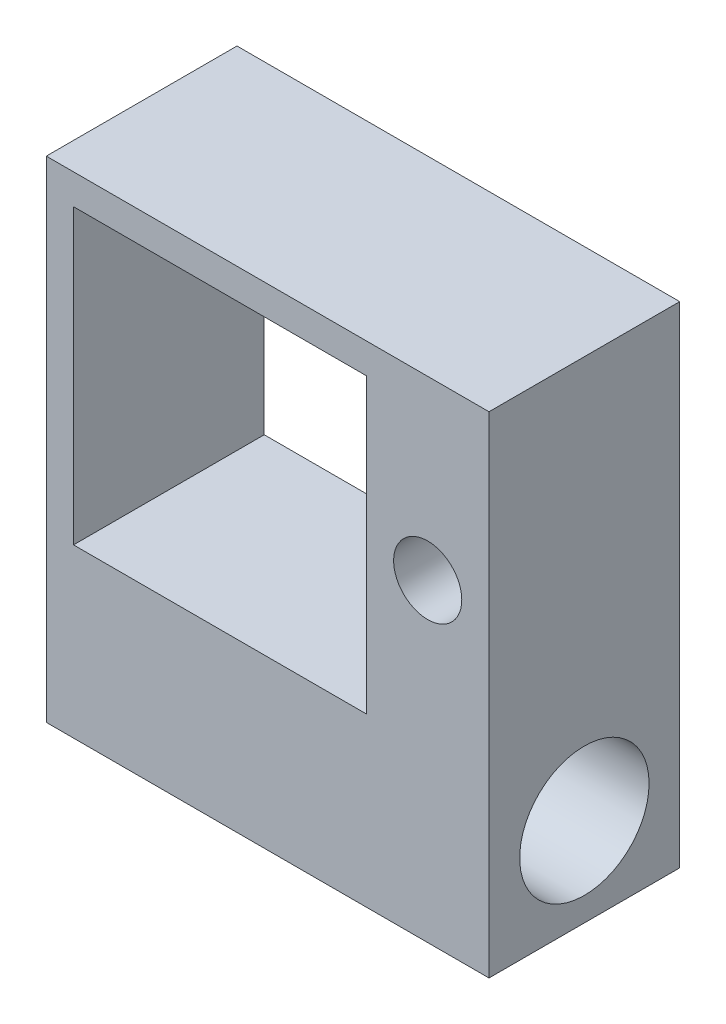
ISO-10303-21;
HEADER;
FILE_DESCRIPTION(('STEP AP214'),'2;1');
FILE_NAME('part.step','',(''),(''),'','','');
FILE_SCHEMA(('AUTOMOTIVE_DESIGN { 1 0 10303 214 1 1 1 1 }'));
ENDSEC;
DATA;
#1=APPLICATION_CONTEXT('core data for automotive mechanical design processes');
#2=APPLICATION_PROTOCOL_DEFINITION('international standard','automotive_design',2000,#1);
#3=PRODUCT_CONTEXT('',#1,'mechanical');
#4=PRODUCT('Part','Part','',(#3));
#5=PRODUCT_RELATED_PRODUCT_CATEGORY('part','',(#4));
#6=PRODUCT_DEFINITION_FORMATION('','',#4);
#7=PRODUCT_DEFINITION_CONTEXT('part definition',#1,'design');
#8=PRODUCT_DEFINITION('design','',#6,#7);
#9=PRODUCT_DEFINITION_SHAPE('','',#8);
#10=(LENGTH_UNIT() NAMED_UNIT(*) SI_UNIT(.MILLI.,.METRE.));
#11=(NAMED_UNIT(*) PLANE_ANGLE_UNIT() SI_UNIT($,.RADIAN.));
#12=(NAMED_UNIT(*) SI_UNIT($,.STERADIAN.) SOLID_ANGLE_UNIT());
#13=UNCERTAINTY_MEASURE_WITH_UNIT(LENGTH_MEASURE(1.E-05),#10,'distance_accuracy_value','');
#14=(GEOMETRIC_REPRESENTATION_CONTEXT(3) GLOBAL_UNCERTAINTY_ASSIGNED_CONTEXT((#13)) GLOBAL_UNIT_ASSIGNED_CONTEXT((#10,
#11,#12)) REPRESENTATION_CONTEXT('',''));
#15=CARTESIAN_POINT('',(0.,0.,0.));
#16=DIRECTION('',(0.,0.,1.));
#17=DIRECTION('',(1.,0.,0.));
#18=AXIS2_PLACEMENT_3D('',#15,#16,#17);
#19=CARTESIAN_POINT('',(0.,0.,28.));
#20=DIRECTION('',(0.,0.,-1.));
#21=DIRECTION('',(-1.,0.,0.));
#22=AXIS2_PLACEMENT_3D('',#19,#20,#21);
#23=PLANE('',#22);
#24=DIRECTION('',(0.,1.,0.));
#25=VECTOR('',#24,1.);
#26=CARTESIAN_POINT('',(32.5,-36.,28.));
#27=LINE('',#26,#25);
#28=CARTESIAN_POINT('',(32.5,-36.,28.));
#29=VERTEX_POINT('',#28);
#30=CARTESIAN_POINT('',(32.5,36.,28.));
#31=VERTEX_POINT('',#30);
#32=EDGE_CURVE('E141',#29,#31,#27,.T.);
#33=ORIENTED_EDGE('',*,*,#32,.T.);
#34=DIRECTION('',(-1.,0.,0.));
#35=VECTOR('',#34,1.);
#36=CARTESIAN_POINT('',(-32.5,36.,28.));
#37=LINE('',#36,#35);
#38=CARTESIAN_POINT('',(-32.5,36.,28.));
#39=VERTEX_POINT('',#38);
#40=EDGE_CURVE('E144',#31,#39,#37,.T.);
#41=ORIENTED_EDGE('',*,*,#40,.T.);
#42=DIRECTION('',(0.,-1.,0.));
#43=VECTOR('',#42,1.);
#44=CARTESIAN_POINT('',(-32.5,-36.,28.));
#45=LINE('',#44,#43);
#46=CARTESIAN_POINT('',(-32.5,-36.,28.));
#47=VERTEX_POINT('',#46);
#48=EDGE_CURVE('E147',#39,#47,#45,.T.);
#49=ORIENTED_EDGE('',*,*,#48,.T.);
#50=DIRECTION('',(1.,0.,0.));
#51=VECTOR('',#50,1.);
#52=CARTESIAN_POINT('',(-32.5,-36.,28.));
#53=LINE('',#52,#51);
#54=EDGE_CURVE('E149',#47,#29,#53,.T.);
#55=ORIENTED_EDGE('',*,*,#54,.T.);
#56=EDGE_LOOP('',(#33,#41,#49,#55));
#57=FACE_BOUND('',#56,.T.);
#58=DIRECTION('',(0.,-1.,0.));
#59=VECTOR('',#58,1.);
#60=CARTESIAN_POINT('',(-28.5,31.5692307692308,28.));
#61=LINE('',#60,#59);
#62=CARTESIAN_POINT('',(-28.5,31.5692307692308,28.));
#63=VERTEX_POINT('',#62);
#64=CARTESIAN_POINT('',(-28.5,-11.4307692307692,28.));
#65=VERTEX_POINT('',#64);
#66=EDGE_CURVE('E102',#63,#65,#61,.T.);
#67=ORIENTED_EDGE('',*,*,#66,.F.);
#68=DIRECTION('',(-1.,0.,0.));
#69=VECTOR('',#68,1.);
#70=CARTESIAN_POINT('',(-28.5,31.5692307692308,28.));
#71=LINE('',#70,#69);
#72=CARTESIAN_POINT('',(14.5,31.5692307692308,28.));
#73=VERTEX_POINT('',#72);
#74=EDGE_CURVE('E125',#73,#63,#71,.T.);
#75=ORIENTED_EDGE('',*,*,#74,.F.);
#76=DIRECTION('',(0.,1.,0.));
#77=VECTOR('',#76,1.);
#78=CARTESIAN_POINT('',(14.5,31.5692307692308,28.));
#79=LINE('',#78,#77);
#80=CARTESIAN_POINT('',(14.5,-11.4307692307692,28.));
#81=VERTEX_POINT('',#80);
#82=EDGE_CURVE('E123',#81,#73,#79,.T.);
#83=ORIENTED_EDGE('',*,*,#82,.F.);
#84=DIRECTION('',(1.,0.,0.));
#85=VECTOR('',#84,1.);
#86=CARTESIAN_POINT('',(-28.5,-11.4307692307692,28.));
#87=LINE('',#86,#85);
#88=EDGE_CURVE('E110',#65,#81,#87,.T.);
#89=ORIENTED_EDGE('',*,*,#88,.F.);
#90=EDGE_LOOP('',(#67,#75,#83,#89));
#91=FACE_BOUND('',#90,.T.);
#92=CARTESIAN_POINT('',(23.5,10.0692307692308,28.));
#93=DIRECTION('',(0.,0.,1.));
#94=DIRECTION('',(1.,0.,0.));
#95=AXIS2_PLACEMENT_3D('',#92,#93,#94);
#96=CIRCLE('',#95,5.);
#97=CARTESIAN_POINT('',(28.5,10.0692307692308,28.));
#98=VERTEX_POINT('',#97);
#99=EDGE_CURVE('E131',#98,#98,#96,.T.);
#100=ORIENTED_EDGE('',*,*,#99,.F.);
#101=EDGE_LOOP('',(#100));
#102=FACE_BOUND('',#101,.T.);
#103=ADVANCED_FACE('F37',(#57,#91,#102),#23,.F.);
#104=CARTESIAN_POINT('',(0.,0.,0.));
#105=DIRECTION('',(0.,0.,-1.));
#106=DIRECTION('',(-1.,0.,0.));
#107=AXIS2_PLACEMENT_3D('',#104,#105,#106);
#108=PLANE('',#107);
#109=DIRECTION('',(-1.,0.,0.));
#110=VECTOR('',#109,1.);
#111=CARTESIAN_POINT('',(-28.5,31.5692307692308,0.));
#112=LINE('',#111,#110);
#113=CARTESIAN_POINT('',(14.5,31.5692307692308,0.));
#114=VERTEX_POINT('',#113);
#115=CARTESIAN_POINT('',(-28.5,31.5692307692308,0.));
#116=VERTEX_POINT('',#115);
#117=EDGE_CURVE('E111',#114,#116,#112,.T.);
#118=ORIENTED_EDGE('',*,*,#117,.T.);
#119=DIRECTION('',(0.,-1.,0.));
#120=VECTOR('',#119,1.);
#121=CARTESIAN_POINT('',(-28.5,31.5692307692308,0.));
#122=LINE('',#121,#120);
#123=CARTESIAN_POINT('',(-28.5,-11.4307692307692,0.));
#124=VERTEX_POINT('',#123);
#125=EDGE_CURVE('E60',#116,#124,#122,.T.);
#126=ORIENTED_EDGE('',*,*,#125,.T.);
#127=DIRECTION('',(1.,0.,0.));
#128=VECTOR('',#127,1.);
#129=CARTESIAN_POINT('',(-28.5,-11.4307692307692,0.));
#130=LINE('',#129,#128);
#131=CARTESIAN_POINT('',(14.5,-11.4307692307692,0.));
#132=VERTEX_POINT('',#131);
#133=EDGE_CURVE('E117',#124,#132,#130,.T.);
#134=ORIENTED_EDGE('',*,*,#133,.T.);
#135=DIRECTION('',(0.,1.,0.));
#136=VECTOR('',#135,1.);
#137=CARTESIAN_POINT('',(14.5,31.5692307692308,0.));
#138=LINE('',#137,#136);
#139=EDGE_CURVE('E133',#132,#114,#138,.T.);
#140=ORIENTED_EDGE('',*,*,#139,.T.);
#141=EDGE_LOOP('',(#118,#126,#134,#140));
#142=FACE_BOUND('',#141,.T.);
#143=DIRECTION('',(0.,1.,0.));
#144=VECTOR('',#143,1.);
#145=CARTESIAN_POINT('',(32.5,-36.,0.));
#146=LINE('',#145,#144);
#147=CARTESIAN_POINT('',(32.5,-36.,0.));
#148=VERTEX_POINT('',#147);
#149=CARTESIAN_POINT('',(32.5,36.,0.));
#150=VERTEX_POINT('',#149);
#151=EDGE_CURVE('E118',#148,#150,#146,.T.);
#152=ORIENTED_EDGE('',*,*,#151,.F.);
#153=DIRECTION('',(1.,0.,0.));
#154=VECTOR('',#153,1.);
#155=CARTESIAN_POINT('',(-32.5,-36.,0.));
#156=LINE('',#155,#154);
#157=CARTESIAN_POINT('',(-32.5,-36.,0.));
#158=VERTEX_POINT('',#157);
#159=EDGE_CURVE('E145',#158,#148,#156,.T.);
#160=ORIENTED_EDGE('',*,*,#159,.F.);
#161=DIRECTION('',(0.,-1.,0.));
#162=VECTOR('',#161,1.);
#163=CARTESIAN_POINT('',(-32.5,-36.,0.));
#164=LINE('',#163,#162);
#165=CARTESIAN_POINT('',(-32.5,36.,0.));
#166=VERTEX_POINT('',#165);
#167=EDGE_CURVE('E156',#166,#158,#164,.T.);
#168=ORIENTED_EDGE('',*,*,#167,.F.);
#169=DIRECTION('',(-1.,0.,0.));
#170=VECTOR('',#169,1.);
#171=CARTESIAN_POINT('',(-32.5,36.,0.));
#172=LINE('',#171,#170);
#173=EDGE_CURVE('E154',#150,#166,#172,.T.);
#174=ORIENTED_EDGE('',*,*,#173,.F.);
#175=EDGE_LOOP('',(#152,#160,#168,#174));
#176=FACE_BOUND('',#175,.T.);
#177=CARTESIAN_POINT('',(23.5,10.0692307692308,0.));
#178=DIRECTION('',(0.,0.,1.));
#179=DIRECTION('',(1.,0.,0.));
#180=AXIS2_PLACEMENT_3D('',#177,#178,#179);
#181=CIRCLE('',#180,5.);
#182=CARTESIAN_POINT('',(28.5,10.0692307692308,0.));
#183=VERTEX_POINT('',#182);
#184=EDGE_CURVE('E237',#183,#183,#181,.T.);
#185=ORIENTED_EDGE('',*,*,#184,.T.);
#186=EDGE_LOOP('',(#185));
#187=FACE_BOUND('',#186,.T.);
#188=ADVANCED_FACE('F174',(#142,#176,#187),#108,.T.);
#189=CARTESIAN_POINT('',(32.5,-36.,28.));
#190=DIRECTION('',(-1.,0.,0.));
#191=DIRECTION('',(0.,0.,1.));
#192=AXIS2_PLACEMENT_3D('',#189,#190,#191);
#193=PLANE('',#192);
#194=CARTESIAN_POINT('',(32.5,-23.,14.));
#195=DIRECTION('',(1.,0.,0.));
#196=DIRECTION('',(0.,0.,-1.));
#197=AXIS2_PLACEMENT_3D('',#194,#195,#196);
#198=CIRCLE('',#197,9.5);
#199=CARTESIAN_POINT('',(32.5,-23.,4.5));
#200=VERTEX_POINT('',#199);
#201=EDGE_CURVE('E235',#200,#200,#198,.T.);
#202=ORIENTED_EDGE('',*,*,#201,.F.);
#203=EDGE_LOOP('',(#202));
#204=FACE_BOUND('',#203,.T.);
#205=ORIENTED_EDGE('',*,*,#151,.T.);
#206=DIRECTION('',(0.,0.,-1.));
#207=VECTOR('',#206,1.);
#208=CARTESIAN_POINT('',(32.5,36.,28.));
#209=LINE('',#208,#207);
#210=EDGE_CURVE('E11',#31,#150,#209,.T.);
#211=ORIENTED_EDGE('',*,*,#210,.F.);
#212=ORIENTED_EDGE('',*,*,#32,.F.);
#213=DIRECTION('',(0.,0.,-1.));
#214=VECTOR('',#213,1.);
#215=CARTESIAN_POINT('',(32.5,-36.,28.));
#216=LINE('',#215,#214);
#217=EDGE_CURVE('E151',#29,#148,#216,.T.);
#218=ORIENTED_EDGE('',*,*,#217,.T.);
#219=EDGE_LOOP('',(#205,#211,#212,#218));
#220=FACE_BOUND('',#219,.T.);
#221=ADVANCED_FACE('F39',(#204,#220),#193,.F.);
#222=CARTESIAN_POINT('',(-32.5,36.,28.));
#223=DIRECTION('',(0.,-1.,0.));
#224=DIRECTION('',(0.,0.,-1.));
#225=AXIS2_PLACEMENT_3D('',#222,#223,#224);
#226=PLANE('',#225);
#227=ORIENTED_EDGE('',*,*,#173,.T.);
#228=DIRECTION('',(0.,0.,-1.));
#229=VECTOR('',#228,1.);
#230=CARTESIAN_POINT('',(-32.5,36.,28.));
#231=LINE('',#230,#229);
#232=EDGE_CURVE('E45',#39,#166,#231,.T.);
#233=ORIENTED_EDGE('',*,*,#232,.F.);
#234=ORIENTED_EDGE('',*,*,#40,.F.);
#235=ORIENTED_EDGE('',*,*,#210,.T.);
#236=EDGE_LOOP('',(#227,#233,#234,#235));
#237=FACE_BOUND('',#236,.T.);
#238=ADVANCED_FACE('F184',(#237),#226,.F.);
#239=CARTESIAN_POINT('',(-32.5,-36.,28.));
#240=DIRECTION('',(1.,0.,0.));
#241=DIRECTION('',(0.,0.,-1.));
#242=AXIS2_PLACEMENT_3D('',#239,#240,#241);
#243=PLANE('',#242);
#244=CARTESIAN_POINT('',(-32.5,-23.,14.));
#245=DIRECTION('',(1.,0.,0.));
#246=DIRECTION('',(0.,0.,-1.));
#247=AXIS2_PLACEMENT_3D('',#244,#245,#246);
#248=CIRCLE('',#247,9.5);
#249=CARTESIAN_POINT('',(-32.5,-23.,4.5));
#250=VERTEX_POINT('',#249);
#251=EDGE_CURVE('E232',#250,#250,#248,.T.);
#252=ORIENTED_EDGE('',*,*,#251,.T.);
#253=EDGE_LOOP('',(#252));
#254=FACE_BOUND('',#253,.T.);
#255=ORIENTED_EDGE('',*,*,#167,.T.);
#256=DIRECTION('',(0.,0.,-1.));
#257=VECTOR('',#256,1.);
#258=CARTESIAN_POINT('',(-32.5,-36.,28.));
#259=LINE('',#258,#257);
#260=EDGE_CURVE('E161',#47,#158,#259,.T.);
#261=ORIENTED_EDGE('',*,*,#260,.F.);
#262=ORIENTED_EDGE('',*,*,#48,.F.);
#263=ORIENTED_EDGE('',*,*,#232,.T.);
#264=EDGE_LOOP('',(#255,#261,#262,#263));
#265=FACE_BOUND('',#264,.T.);
#266=ADVANCED_FACE('F168',(#254,#265),#243,.F.);
#267=CARTESIAN_POINT('',(-32.5,-36.,28.));
#268=DIRECTION('',(0.,1.,0.));
#269=DIRECTION('',(0.,0.,1.));
#270=AXIS2_PLACEMENT_3D('',#267,#268,#269);
#271=PLANE('',#270);
#272=ORIENTED_EDGE('',*,*,#159,.T.);
#273=ORIENTED_EDGE('',*,*,#217,.F.);
#274=ORIENTED_EDGE('',*,*,#54,.F.);
#275=ORIENTED_EDGE('',*,*,#260,.T.);
#276=EDGE_LOOP('',(#272,#273,#274,#275));
#277=FACE_BOUND('',#276,.T.);
#278=ADVANCED_FACE('F178',(#277),#271,.F.);
#279=CARTESIAN_POINT('',(-28.5,31.5692307692308,28.));
#280=DIRECTION('',(1.,0.,0.));
#281=DIRECTION('',(0.,1.,0.));
#282=AXIS2_PLACEMENT_3D('',#279,#280,#281);
#283=PLANE('',#282);
#284=ORIENTED_EDGE('',*,*,#125,.F.);
#285=DIRECTION('',(0.,0.,-1.));
#286=VECTOR('',#285,1.);
#287=CARTESIAN_POINT('',(-28.5,31.5692307692308,28.));
#288=LINE('',#287,#286);
#289=EDGE_CURVE('E106',#63,#116,#288,.T.);
#290=ORIENTED_EDGE('',*,*,#289,.F.);
#291=ORIENTED_EDGE('',*,*,#66,.T.);
#292=DIRECTION('',(0.,0.,-1.));
#293=VECTOR('',#292,1.);
#294=CARTESIAN_POINT('',(-28.5,-11.4307692307692,28.));
#295=LINE('',#294,#293);
#296=EDGE_CURVE('E105',#65,#124,#295,.T.);
#297=ORIENTED_EDGE('',*,*,#296,.T.);
#298=EDGE_LOOP('',(#284,#290,#291,#297));
#299=FACE_BOUND('',#298,.T.);
#300=ADVANCED_FACE('F104',(#299),#283,.T.);
#301=CARTESIAN_POINT('',(-28.5,-11.4307692307692,28.));
#302=DIRECTION('',(0.,1.,0.));
#303=DIRECTION('',(-1.,0.,0.));
#304=AXIS2_PLACEMENT_3D('',#301,#302,#303);
#305=PLANE('',#304);
#306=ORIENTED_EDGE('',*,*,#133,.F.);
#307=ORIENTED_EDGE('',*,*,#296,.F.);
#308=ORIENTED_EDGE('',*,*,#88,.T.);
#309=DIRECTION('',(0.,0.,-1.));
#310=VECTOR('',#309,1.);
#311=CARTESIAN_POINT('',(14.5,-11.4307692307692,28.));
#312=LINE('',#311,#310);
#313=EDGE_CURVE('E119',#81,#132,#312,.T.);
#314=ORIENTED_EDGE('',*,*,#313,.T.);
#315=EDGE_LOOP('',(#306,#307,#308,#314));
#316=FACE_BOUND('',#315,.T.);
#317=ADVANCED_FACE('F114',(#316),#305,.T.);
#318=CARTESIAN_POINT('',(14.5,31.5692307692308,28.));
#319=DIRECTION('',(-1.,0.,0.));
#320=DIRECTION('',(0.,-1.,0.));
#321=AXIS2_PLACEMENT_3D('',#318,#319,#320);
#322=PLANE('',#321);
#323=ORIENTED_EDGE('',*,*,#139,.F.);
#324=ORIENTED_EDGE('',*,*,#313,.F.);
#325=ORIENTED_EDGE('',*,*,#82,.T.);
#326=DIRECTION('',(0.,0.,-1.));
#327=VECTOR('',#326,1.);
#328=CARTESIAN_POINT('',(14.5,31.5692307692308,28.));
#329=LINE('',#328,#327);
#330=EDGE_CURVE('E52',#73,#114,#329,.T.);
#331=ORIENTED_EDGE('',*,*,#330,.T.);
#332=EDGE_LOOP('',(#323,#324,#325,#331));
#333=FACE_BOUND('',#332,.T.);
#334=ADVANCED_FACE('F210',(#333),#322,.T.);
#335=CARTESIAN_POINT('',(-28.5,31.5692307692308,28.));
#336=DIRECTION('',(0.,-1.,0.));
#337=DIRECTION('',(1.,0.,0.));
#338=AXIS2_PLACEMENT_3D('',#335,#336,#337);
#339=PLANE('',#338);
#340=ORIENTED_EDGE('',*,*,#117,.F.);
#341=ORIENTED_EDGE('',*,*,#330,.F.);
#342=ORIENTED_EDGE('',*,*,#74,.T.);
#343=ORIENTED_EDGE('',*,*,#289,.T.);
#344=EDGE_LOOP('',(#340,#341,#342,#343));
#345=FACE_BOUND('',#344,.T.);
#346=ADVANCED_FACE('F214',(#345),#339,.T.);
#347=CARTESIAN_POINT('',(23.5,10.0692307692308,28.));
#348=DIRECTION('',(0.,0.,-1.));
#349=DIRECTION('',(-1.,0.,0.));
#350=AXIS2_PLACEMENT_3D('',#347,#348,#349);
#351=CYLINDRICAL_SURFACE('',#350,5.);
#352=ORIENTED_EDGE('',*,*,#99,.T.);
#353=EDGE_LOOP('',(#352));
#354=FACE_BOUND('',#353,.T.);
#355=ORIENTED_EDGE('',*,*,#184,.F.);
#356=EDGE_LOOP('',(#355));
#357=FACE_BOUND('',#356,.T.);
#358=ADVANCED_FACE('F220',(#354,#357),#351,.F.);
#359=CARTESIAN_POINT('',(-32.5,-23.,14.));
#360=DIRECTION('',(1.,0.,0.));
#361=DIRECTION('',(0.,0.,-1.));
#362=AXIS2_PLACEMENT_3D('',#359,#360,#361);
#363=CYLINDRICAL_SURFACE('',#362,9.5);
#364=ORIENTED_EDGE('',*,*,#251,.F.);
#365=EDGE_LOOP('',(#364));
#366=FACE_BOUND('',#365,.T.);
#367=ORIENTED_EDGE('',*,*,#201,.T.);
#368=EDGE_LOOP('',(#367));
#369=FACE_BOUND('',#368,.T.);
#370=ADVANCED_FACE('F223',(#366,#369),#363,.F.);
#371=CLOSED_SHELL('',(#103,#188,#221,#238,#266,#278,#300,#317,#334,#346,#358,#370));
#372=MANIFOLD_SOLID_BREP('B2',#371);
#373=ADVANCED_BREP_SHAPE_REPRESENTATION('',(#18,#372),#14);
#374=SHAPE_DEFINITION_REPRESENTATION(#9,#373);
ENDSEC;
END-ISO-10303-21;
